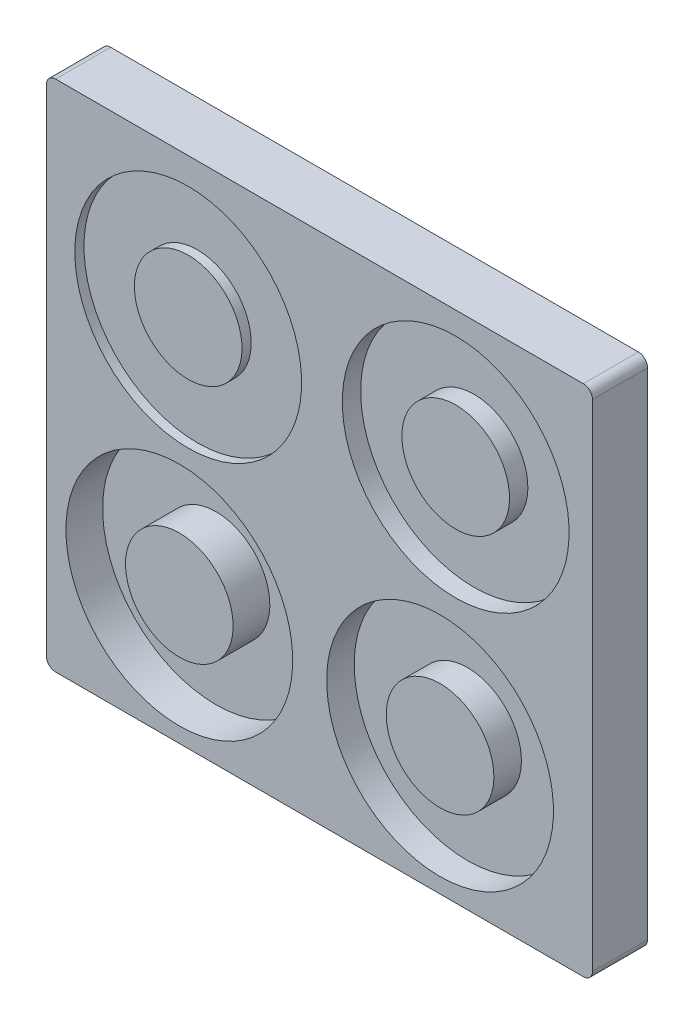
ISO-10303-21;
HEADER;
FILE_DESCRIPTION(('STEP AP214'),'2;1');
FILE_NAME('part.step','',(''),(''),'','','');
FILE_SCHEMA(('AUTOMOTIVE_DESIGN { 1 0 10303 214 1 1 1 1 }'));
ENDSEC;
DATA;
#1=APPLICATION_CONTEXT('core data for automotive mechanical design processes');
#2=APPLICATION_PROTOCOL_DEFINITION('international standard','automotive_design',2000,#1);
#3=PRODUCT_CONTEXT('',#1,'mechanical');
#4=PRODUCT('Part','Part','',(#3));
#5=PRODUCT_RELATED_PRODUCT_CATEGORY('part','',(#4));
#6=PRODUCT_DEFINITION_FORMATION('','',#4);
#7=PRODUCT_DEFINITION_CONTEXT('part definition',#1,'design');
#8=PRODUCT_DEFINITION('design','',#6,#7);
#9=PRODUCT_DEFINITION_SHAPE('','',#8);
#10=(LENGTH_UNIT() NAMED_UNIT(*) SI_UNIT(.MILLI.,.METRE.));
#11=(NAMED_UNIT(*) PLANE_ANGLE_UNIT() SI_UNIT($,.RADIAN.));
#12=(NAMED_UNIT(*) SI_UNIT($,.STERADIAN.) SOLID_ANGLE_UNIT());
#13=UNCERTAINTY_MEASURE_WITH_UNIT(LENGTH_MEASURE(1.E-05),#10,'distance_accuracy_value','');
#14=(GEOMETRIC_REPRESENTATION_CONTEXT(3) GLOBAL_UNCERTAINTY_ASSIGNED_CONTEXT((#13)) GLOBAL_UNIT_ASSIGNED_CONTEXT((#10,
#11,#12)) REPRESENTATION_CONTEXT('',''));
#15=CARTESIAN_POINT('',(0.,0.,0.));
#16=DIRECTION('',(0.,0.,1.));
#17=DIRECTION('',(1.,0.,0.));
#18=AXIS2_PLACEMENT_3D('',#15,#16,#17);
#19=CARTESIAN_POINT('',(-14.4541081383393,-39.7227767062655,0.));
#20=DIRECTION('',(0.,0.,1.));
#21=DIRECTION('',(1.,0.,0.));
#22=AXIS2_PLACEMENT_3D('',#19,#20,#21);
#23=PLANE('',#22);
#24=CARTESIAN_POINT('',(29.1575580222274,0.43729778627492,0.));
#25=DIRECTION('',(0.,0.,1.));
#26=DIRECTION('',(0.,-1.,0.));
#27=AXIS2_PLACEMENT_3D('',#24,#25,#26);
#28=CIRCLE('',#27,12.36);
#29=CARTESIAN_POINT('',(29.1575580222274,-11.9227022137251,0.));
#30=VERTEX_POINT('',#29);
#31=EDGE_CURVE('E337',#30,#30,#28,.T.);
#32=ORIENTED_EDGE('',*,*,#31,.F.);
#33=EDGE_LOOP('',(#32));
#34=FACE_BOUND('',#33,.T.);
#35=CARTESIAN_POINT('',(-0.968104394732787,-26.7082391513316,0.));
#36=DIRECTION('',(0.,0.,1.));
#37=DIRECTION('',(0.,-1.,0.));
#38=AXIS2_PLACEMENT_3D('',#35,#36,#37);
#39=CIRCLE('',#38,12.36);
#40=CARTESIAN_POINT('',(-0.968104394732787,-39.0682391513316,0.));
#41=VERTEX_POINT('',#40);
#42=EDGE_CURVE('E152',#41,#41,#39,.T.);
#43=ORIENTED_EDGE('',*,*,#42,.F.);
#44=EDGE_LOOP('',(#43));
#45=FACE_BOUND('',#44,.T.);
#46=CARTESIAN_POINT('',(-14.4541081383393,-39.7227767062655,0.));
#47=DIRECTION('',(0.,0.,1.));
#48=DIRECTION('',(1.,0.,0.));
#49=AXIS2_PLACEMENT_3D('',#46,#47,#48);
#50=CIRCLE('',#49,1.);
#51=CARTESIAN_POINT('',(-15.4541081383393,-39.7227767062655,0.));
#52=VERTEX_POINT('',#51);
#53=CARTESIAN_POINT('',(-14.4541081383393,-40.7227767062655,0.));
#54=VERTEX_POINT('',#53);
#55=EDGE_CURVE('E147',#52,#54,#50,.T.);
#56=ORIENTED_EDGE('',*,*,#55,.T.);
#57=DIRECTION('',(1.,0.,0.));
#58=VECTOR('',#57,1.);
#59=CARTESIAN_POINT('',(-14.4541081383393,-40.7227767062655,0.));
#60=LINE('',#59,#58);
#61=CARTESIAN_POINT('',(43.0726208084836,-40.7227767062655,0.));
#62=VERTEX_POINT('',#61);
#63=EDGE_CURVE('E151',#54,#62,#60,.T.);
#64=ORIENTED_EDGE('',*,*,#63,.T.);
#65=CARTESIAN_POINT('',(43.0726208084836,-39.7227767062655,0.));
#66=DIRECTION('',(0.,0.,1.));
#67=DIRECTION('',(-1.,0.,0.));
#68=AXIS2_PLACEMENT_3D('',#65,#66,#67);
#69=CIRCLE('',#68,0.999999999999997);
#70=CARTESIAN_POINT('',(44.0726208084836,-39.7227767062655,0.));
#71=VERTEX_POINT('',#70);
#72=EDGE_CURVE('E156',#62,#71,#69,.T.);
#73=ORIENTED_EDGE('',*,*,#72,.T.);
#74=DIRECTION('',(0.,1.,0.));
#75=VECTOR('',#74,1.);
#76=CARTESIAN_POINT('',(44.0726208084836,14.2579563912,0.));
#77=LINE('',#76,#75);
#78=CARTESIAN_POINT('',(44.0726208084836,14.2579563912,0.));
#79=VERTEX_POINT('',#78);
#80=EDGE_CURVE('E160',#71,#79,#77,.T.);
#81=ORIENTED_EDGE('',*,*,#80,.T.);
#82=CARTESIAN_POINT('',(43.0726208084836,14.2579563912,0.));
#83=DIRECTION('',(0.,0.,1.));
#84=DIRECTION('',(1.,0.,0.));
#85=AXIS2_PLACEMENT_3D('',#82,#83,#84);
#86=CIRCLE('',#85,1.);
#87=CARTESIAN_POINT('',(43.0726208084836,15.2579563912,0.));
#88=VERTEX_POINT('',#87);
#89=EDGE_CURVE('E164',#79,#88,#86,.T.);
#90=ORIENTED_EDGE('',*,*,#89,.T.);
#91=DIRECTION('',(-1.,0.,0.));
#92=VECTOR('',#91,1.);
#93=CARTESIAN_POINT('',(-14.4541081383393,15.2579563912,0.));
#94=LINE('',#93,#92);
#95=CARTESIAN_POINT('',(-14.4541081383393,15.2579563912,0.));
#96=VERTEX_POINT('',#95);
#97=EDGE_CURVE('E168',#88,#96,#94,.T.);
#98=ORIENTED_EDGE('',*,*,#97,.T.);
#99=CARTESIAN_POINT('',(-14.4541081383393,14.2579563912,0.));
#100=DIRECTION('',(0.,0.,1.));
#101=DIRECTION('',(-1.,0.,0.));
#102=AXIS2_PLACEMENT_3D('',#99,#100,#101);
#103=CIRCLE('',#102,1.);
#104=CARTESIAN_POINT('',(-15.4541081383393,14.2579563912,0.));
#105=VERTEX_POINT('',#104);
#106=EDGE_CURVE('E119',#96,#105,#103,.T.);
#107=ORIENTED_EDGE('',*,*,#106,.T.);
#108=DIRECTION('',(0.,-1.,0.));
#109=VECTOR('',#108,1.);
#110=CARTESIAN_POINT('',(-15.4541081383393,14.2579563912,0.));
#111=LINE('',#110,#109);
#112=EDGE_CURVE('E173',#105,#52,#111,.T.);
#113=ORIENTED_EDGE('',*,*,#112,.T.);
#114=EDGE_LOOP('',(#56,#64,#73,#81,#90,#98,#107,#113));
#115=FACE_BOUND('',#114,.T.);
#116=CARTESIAN_POINT('',(27.4531010206422,-26.7169449523038,0.));
#117=DIRECTION('',(0.,0.,1.));
#118=DIRECTION('',(0.,-1.,0.));
#119=AXIS2_PLACEMENT_3D('',#116,#117,#118);
#120=CIRCLE('',#119,12.36);
#121=CARTESIAN_POINT('',(27.4531010206422,-39.0769449523038,0.));
#122=VERTEX_POINT('',#121);
#123=EDGE_CURVE('E240',#122,#122,#120,.T.);
#124=ORIENTED_EDGE('',*,*,#123,.F.);
#125=EDGE_LOOP('',(#124));
#126=FACE_BOUND('',#125,.T.);
#127=CARTESIAN_POINT('',(0.,0.,0.));
#128=DIRECTION('',(0.,0.,1.));
#129=DIRECTION('',(0.,-1.,0.));
#130=AXIS2_PLACEMENT_3D('',#127,#128,#129);
#131=CIRCLE('',#130,12.36);
#132=CARTESIAN_POINT('',(0.,-12.36,0.));
#133=VERTEX_POINT('',#132);
#134=EDGE_CURVE('E360',#133,#133,#131,.T.);
#135=ORIENTED_EDGE('',*,*,#134,.F.);
#136=EDGE_LOOP('',(#135));
#137=FACE_BOUND('',#136,.T.);
#138=ADVANCED_FACE('F43',(#34,#45,#115,#126,#137),#23,.T.);
#139=CARTESIAN_POINT('',(-14.4541081383393,-39.7227767062655,-6.));
#140=DIRECTION('',(0.,0.,1.));
#141=DIRECTION('',(1.,0.,0.));
#142=AXIS2_PLACEMENT_3D('',#139,#140,#141);
#143=CYLINDRICAL_SURFACE('',#142,1.);
#144=ORIENTED_EDGE('',*,*,#55,.F.);
#145=DIRECTION('',(0.,0.,1.));
#146=VECTOR('',#145,1.);
#147=CARTESIAN_POINT('',(-15.4541081383393,-39.7227767062655,-6.));
#148=LINE('',#147,#146);
#149=CARTESIAN_POINT('',(-15.4541081383393,-39.7227767062655,-6.));
#150=VERTEX_POINT('',#149);
#151=EDGE_CURVE('E11',#150,#52,#148,.T.);
#152=ORIENTED_EDGE('',*,*,#151,.F.);
#153=CARTESIAN_POINT('',(-14.4541081383393,-39.7227767062655,-6.));
#154=DIRECTION('',(0.,0.,1.));
#155=DIRECTION('',(1.,0.,0.));
#156=AXIS2_PLACEMENT_3D('',#153,#154,#155);
#157=CIRCLE('',#156,1.);
#158=CARTESIAN_POINT('',(-14.4541081383393,-40.7227767062655,-6.));
#159=VERTEX_POINT('',#158);
#160=EDGE_CURVE('E176',#150,#159,#157,.T.);
#161=ORIENTED_EDGE('',*,*,#160,.T.);
#162=DIRECTION('',(0.,0.,1.));
#163=VECTOR('',#162,1.);
#164=CARTESIAN_POINT('',(-14.4541081383393,-40.7227767062655,-6.));
#165=LINE('',#164,#163);
#166=EDGE_CURVE('E47',#159,#54,#165,.T.);
#167=ORIENTED_EDGE('',*,*,#166,.T.);
#168=EDGE_LOOP('',(#144,#152,#161,#167));
#169=FACE_BOUND('',#168,.T.);
#170=ADVANCED_FACE('F45',(#169),#143,.T.);
#171=CARTESIAN_POINT('',(-15.4541081383393,14.2579563912,-6.));
#172=DIRECTION('',(-1.,0.,0.));
#173=DIRECTION('',(0.,0.,1.));
#174=AXIS2_PLACEMENT_3D('',#171,#172,#173);
#175=PLANE('',#174);
#176=ORIENTED_EDGE('',*,*,#112,.F.);
#177=DIRECTION('',(0.,0.,1.));
#178=VECTOR('',#177,1.);
#179=CARTESIAN_POINT('',(-15.4541081383393,14.2579563912,-6.));
#180=LINE('',#179,#178);
#181=CARTESIAN_POINT('',(-15.4541081383393,14.2579563912,-6.));
#182=VERTEX_POINT('',#181);
#183=EDGE_CURVE('E54',#182,#105,#180,.T.);
#184=ORIENTED_EDGE('',*,*,#183,.F.);
#185=DIRECTION('',(0.,-1.,0.));
#186=VECTOR('',#185,1.);
#187=CARTESIAN_POINT('',(-15.4541081383393,14.2579563912,-6.));
#188=LINE('',#187,#186);
#189=EDGE_CURVE('E133',#182,#150,#188,.T.);
#190=ORIENTED_EDGE('',*,*,#189,.T.);
#191=ORIENTED_EDGE('',*,*,#151,.T.);
#192=EDGE_LOOP('',(#176,#184,#190,#191));
#193=FACE_BOUND('',#192,.T.);
#194=ADVANCED_FACE('F194',(#193),#175,.T.);
#195=CARTESIAN_POINT('',(-14.4541081383393,14.2579563912,-6.));
#196=DIRECTION('',(0.,0.,1.));
#197=DIRECTION('',(1.,0.,0.));
#198=AXIS2_PLACEMENT_3D('',#195,#196,#197);
#199=CYLINDRICAL_SURFACE('',#198,1.);
#200=ORIENTED_EDGE('',*,*,#106,.F.);
#201=DIRECTION('',(0.,0.,1.));
#202=VECTOR('',#201,1.);
#203=CARTESIAN_POINT('',(-14.4541081383393,15.2579563912,-6.));
#204=LINE('',#203,#202);
#205=CARTESIAN_POINT('',(-14.4541081383393,15.2579563912,-6.));
#206=VERTEX_POINT('',#205);
#207=EDGE_CURVE('E114',#206,#96,#204,.T.);
#208=ORIENTED_EDGE('',*,*,#207,.F.);
#209=CARTESIAN_POINT('',(-14.4541081383393,14.2579563912,-6.));
#210=DIRECTION('',(0.,0.,1.));
#211=DIRECTION('',(-1.,0.,0.));
#212=AXIS2_PLACEMENT_3D('',#209,#210,#211);
#213=CIRCLE('',#212,1.);
#214=EDGE_CURVE('E117',#206,#182,#213,.T.);
#215=ORIENTED_EDGE('',*,*,#214,.T.);
#216=ORIENTED_EDGE('',*,*,#183,.T.);
#217=EDGE_LOOP('',(#200,#208,#215,#216));
#218=FACE_BOUND('',#217,.T.);
#219=ADVANCED_FACE('F116',(#218),#199,.T.);
#220=CARTESIAN_POINT('',(-14.4541081383393,15.2579563912,-6.));
#221=DIRECTION('',(0.,1.,0.));
#222=DIRECTION('',(0.,0.,1.));
#223=AXIS2_PLACEMENT_3D('',#220,#221,#222);
#224=PLANE('',#223);
#225=ORIENTED_EDGE('',*,*,#97,.F.);
#226=DIRECTION('',(0.,0.,1.));
#227=VECTOR('',#226,1.);
#228=CARTESIAN_POINT('',(43.0726208084836,15.2579563912,-6.));
#229=LINE('',#228,#227);
#230=CARTESIAN_POINT('',(43.0726208084836,15.2579563912,-6.));
#231=VERTEX_POINT('',#230);
#232=EDGE_CURVE('E125',#231,#88,#229,.T.);
#233=ORIENTED_EDGE('',*,*,#232,.F.);
#234=DIRECTION('',(-1.,0.,0.));
#235=VECTOR('',#234,1.);
#236=CARTESIAN_POINT('',(-14.4541081383393,15.2579563912,-6.));
#237=LINE('',#236,#235);
#238=EDGE_CURVE('E131',#231,#206,#237,.T.);
#239=ORIENTED_EDGE('',*,*,#238,.T.);
#240=ORIENTED_EDGE('',*,*,#207,.T.);
#241=EDGE_LOOP('',(#225,#233,#239,#240));
#242=FACE_BOUND('',#241,.T.);
#243=ADVANCED_FACE('F136',(#242),#224,.T.);
#244=CARTESIAN_POINT('',(43.0726208084836,14.2579563912,-6.));
#245=DIRECTION('',(0.,0.,1.));
#246=DIRECTION('',(1.,0.,0.));
#247=AXIS2_PLACEMENT_3D('',#244,#245,#246);
#248=CYLINDRICAL_SURFACE('',#247,1.);
#249=ORIENTED_EDGE('',*,*,#89,.F.);
#250=DIRECTION('',(0.,0.,1.));
#251=VECTOR('',#250,1.);
#252=CARTESIAN_POINT('',(44.0726208084836,14.2579563912,-6.));
#253=LINE('',#252,#251);
#254=CARTESIAN_POINT('',(44.0726208084836,14.2579563912,-6.));
#255=VERTEX_POINT('',#254);
#256=EDGE_CURVE('E182',#255,#79,#253,.T.);
#257=ORIENTED_EDGE('',*,*,#256,.F.);
#258=CARTESIAN_POINT('',(43.0726208084836,14.2579563912,-6.));
#259=DIRECTION('',(0.,0.,1.));
#260=DIRECTION('',(1.,0.,0.));
#261=AXIS2_PLACEMENT_3D('',#258,#259,#260);
#262=CIRCLE('',#261,1.);
#263=EDGE_CURVE('E138',#255,#231,#262,.T.);
#264=ORIENTED_EDGE('',*,*,#263,.T.);
#265=ORIENTED_EDGE('',*,*,#232,.T.);
#266=EDGE_LOOP('',(#249,#257,#264,#265));
#267=FACE_BOUND('',#266,.T.);
#268=ADVANCED_FACE('F268',(#267),#248,.T.);
#269=CARTESIAN_POINT('',(44.0726208084836,14.2579563912,-6.));
#270=DIRECTION('',(1.,0.,0.));
#271=DIRECTION('',(0.,1.,0.));
#272=AXIS2_PLACEMENT_3D('',#269,#270,#271);
#273=PLANE('',#272);
#274=ORIENTED_EDGE('',*,*,#80,.F.);
#275=DIRECTION('',(0.,0.,1.));
#276=VECTOR('',#275,1.);
#277=CARTESIAN_POINT('',(44.0726208084836,-39.7227767062655,-6.));
#278=LINE('',#277,#276);
#279=CARTESIAN_POINT('',(44.0726208084836,-39.7227767062655,-6.));
#280=VERTEX_POINT('',#279);
#281=EDGE_CURVE('E185',#280,#71,#278,.T.);
#282=ORIENTED_EDGE('',*,*,#281,.F.);
#283=DIRECTION('',(0.,1.,0.));
#284=VECTOR('',#283,1.);
#285=CARTESIAN_POINT('',(44.0726208084836,14.2579563912,-6.));
#286=LINE('',#285,#284);
#287=EDGE_CURVE('E141',#280,#255,#286,.T.);
#288=ORIENTED_EDGE('',*,*,#287,.T.);
#289=ORIENTED_EDGE('',*,*,#256,.T.);
#290=EDGE_LOOP('',(#274,#282,#288,#289));
#291=FACE_BOUND('',#290,.T.);
#292=ADVANCED_FACE('F262',(#291),#273,.T.);
#293=CARTESIAN_POINT('',(43.0726208084836,-39.7227767062655,-6.));
#294=DIRECTION('',(0.,0.,1.));
#295=DIRECTION('',(1.,0.,0.));
#296=AXIS2_PLACEMENT_3D('',#293,#294,#295);
#297=CYLINDRICAL_SURFACE('',#296,0.999999999999997);
#298=ORIENTED_EDGE('',*,*,#72,.F.);
#299=DIRECTION('',(0.,0.,1.));
#300=VECTOR('',#299,1.);
#301=CARTESIAN_POINT('',(43.0726208084836,-40.7227767062655,-6.));
#302=LINE('',#301,#300);
#303=CARTESIAN_POINT('',(43.0726208084836,-40.7227767062655,-6.));
#304=VERTEX_POINT('',#303);
#305=EDGE_CURVE('E187',#304,#62,#302,.T.);
#306=ORIENTED_EDGE('',*,*,#305,.F.);
#307=CARTESIAN_POINT('',(43.0726208084836,-39.7227767062655,-6.));
#308=DIRECTION('',(0.,0.,1.));
#309=DIRECTION('',(-1.,0.,0.));
#310=AXIS2_PLACEMENT_3D('',#307,#308,#309);
#311=CIRCLE('',#310,0.999999999999997);
#312=EDGE_CURVE('E254',#304,#280,#311,.T.);
#313=ORIENTED_EDGE('',*,*,#312,.T.);
#314=ORIENTED_EDGE('',*,*,#281,.T.);
#315=EDGE_LOOP('',(#298,#306,#313,#314));
#316=FACE_BOUND('',#315,.T.);
#317=ADVANCED_FACE('F266',(#316),#297,.T.);
#318=CARTESIAN_POINT('',(-14.4541081383393,-40.7227767062655,-6.));
#319=DIRECTION('',(0.,-1.,0.));
#320=DIRECTION('',(0.,0.,-1.));
#321=AXIS2_PLACEMENT_3D('',#318,#319,#320);
#322=PLANE('',#321);
#323=ORIENTED_EDGE('',*,*,#63,.F.);
#324=ORIENTED_EDGE('',*,*,#166,.F.);
#325=DIRECTION('',(1.,0.,0.));
#326=VECTOR('',#325,1.);
#327=CARTESIAN_POINT('',(-14.4541081383393,-40.7227767062655,-6.));
#328=LINE('',#327,#326);
#329=EDGE_CURVE('E251',#159,#304,#328,.T.);
#330=ORIENTED_EDGE('',*,*,#329,.T.);
#331=ORIENTED_EDGE('',*,*,#305,.T.);
#332=EDGE_LOOP('',(#323,#324,#330,#331));
#333=FACE_BOUND('',#332,.T.);
#334=ADVANCED_FACE('F191',(#333),#322,.T.);
#335=CARTESIAN_POINT('',(-14.4541081383393,-39.7227767062655,-6.));
#336=DIRECTION('',(0.,0.,1.));
#337=DIRECTION('',(1.,0.,0.));
#338=AXIS2_PLACEMENT_3D('',#335,#336,#337);
#339=PLANE('',#338);
#340=ORIENTED_EDGE('',*,*,#160,.F.);
#341=ORIENTED_EDGE('',*,*,#189,.F.);
#342=ORIENTED_EDGE('',*,*,#214,.F.);
#343=ORIENTED_EDGE('',*,*,#238,.F.);
#344=ORIENTED_EDGE('',*,*,#263,.F.);
#345=ORIENTED_EDGE('',*,*,#287,.F.);
#346=ORIENTED_EDGE('',*,*,#312,.F.);
#347=ORIENTED_EDGE('',*,*,#329,.F.);
#348=EDGE_LOOP('',(#340,#341,#342,#343,#344,#345,#346,#347));
#349=FACE_BOUND('',#348,.T.);
#350=ADVANCED_FACE('F129',(#349),#339,.F.);
#351=CARTESIAN_POINT('',(-0.968104394732787,-26.7082391513316,0.));
#352=DIRECTION('',(0.,0.,-1.));
#353=DIRECTION('',(0.,1.,0.));
#354=AXIS2_PLACEMENT_3D('',#351,#352,#353);
#355=CYLINDRICAL_SURFACE('',#354,12.36);
#356=ORIENTED_EDGE('',*,*,#42,.T.);
#357=EDGE_LOOP('',(#356));
#358=FACE_BOUND('',#357,.T.);
#359=CARTESIAN_POINT('',(-0.968104394732787,-26.7082391513316,-4.));
#360=DIRECTION('',(0.,0.,1.));
#361=DIRECTION('',(0.,-1.,0.));
#362=AXIS2_PLACEMENT_3D('',#359,#360,#361);
#363=CIRCLE('',#362,12.36);
#364=CARTESIAN_POINT('',(-0.968104394732787,-39.0682391513316,-4.));
#365=VERTEX_POINT('',#364);
#366=EDGE_CURVE('E232',#365,#365,#363,.T.);
#367=ORIENTED_EDGE('',*,*,#366,.F.);
#368=EDGE_LOOP('',(#367));
#369=FACE_BOUND('',#368,.T.);
#370=ADVANCED_FACE('F283',(#358,#369),#355,.F.);
#371=CARTESIAN_POINT('',(-0.968104394732787,-26.7082391513316,-4.));
#372=DIRECTION('',(0.,0.,1.));
#373=DIRECTION('',(0.,-1.,0.));
#374=AXIS2_PLACEMENT_3D('',#371,#372,#373);
#375=PLANE('',#374);
#376=CARTESIAN_POINT('',(-0.968104394732787,-26.7082391513316,-4.));
#377=DIRECTION('',(0.,0.,-1.));
#378=DIRECTION('',(0.,1.,0.));
#379=AXIS2_PLACEMENT_3D('',#376,#377,#378);
#380=CIRCLE('',#379,5.8674);
#381=CARTESIAN_POINT('',(-0.968104394732787,-20.8408391513316,-4.));
#382=VERTEX_POINT('',#381);
#383=EDGE_CURVE('E233',#382,#382,#380,.T.);
#384=ORIENTED_EDGE('',*,*,#383,.T.);
#385=EDGE_LOOP('',(#384));
#386=FACE_BOUND('',#385,.T.);
#387=ORIENTED_EDGE('',*,*,#366,.T.);
#388=EDGE_LOOP('',(#387));
#389=FACE_BOUND('',#388,.T.);
#390=ADVANCED_FACE('F287',(#386,#389),#375,.T.);
#391=CARTESIAN_POINT('',(-0.968104394732787,-26.7082391513316,0.));
#392=DIRECTION('',(0.,0.,-1.));
#393=DIRECTION('',(0.,1.,0.));
#394=AXIS2_PLACEMENT_3D('',#391,#392,#393);
#395=CYLINDRICAL_SURFACE('',#394,5.8674);
#396=CARTESIAN_POINT('',(-0.968104394732787,-26.7082391513316,0.));
#397=DIRECTION('',(0.,0.,-1.));
#398=DIRECTION('',(0.,1.,0.));
#399=AXIS2_PLACEMENT_3D('',#396,#397,#398);
#400=CIRCLE('',#399,5.8674);
#401=CARTESIAN_POINT('',(-0.968104394732787,-20.8408391513316,0.));
#402=VERTEX_POINT('',#401);
#403=EDGE_CURVE('E229',#402,#402,#400,.T.);
#404=ORIENTED_EDGE('',*,*,#403,.T.);
#405=EDGE_LOOP('',(#404));
#406=FACE_BOUND('',#405,.T.);
#407=ORIENTED_EDGE('',*,*,#383,.F.);
#408=EDGE_LOOP('',(#407));
#409=FACE_BOUND('',#408,.T.);
#410=ADVANCED_FACE('F293',(#406,#409),#395,.T.);
#411=CARTESIAN_POINT('',(27.4531010206422,-26.7169449523038,0.));
#412=DIRECTION('',(0.,0.,-1.));
#413=DIRECTION('',(0.,1.,0.));
#414=AXIS2_PLACEMENT_3D('',#411,#412,#413);
#415=CYLINDRICAL_SURFACE('',#414,12.36);
#416=ORIENTED_EDGE('',*,*,#123,.T.);
#417=EDGE_LOOP('',(#416));
#418=FACE_BOUND('',#417,.T.);
#419=CARTESIAN_POINT('',(27.4531010206422,-26.7169449523038,-3.00000000000005));
#420=DIRECTION('',(0.,0.,1.));
#421=DIRECTION('',(0.,-1.,0.));
#422=AXIS2_PLACEMENT_3D('',#419,#420,#421);
#423=CIRCLE('',#422,12.36);
#424=CARTESIAN_POINT('',(27.4531010206422,-39.0769449523038,-3.00000000000005));
#425=VERTEX_POINT('',#424);
#426=EDGE_CURVE('E341',#425,#425,#423,.T.);
#427=ORIENTED_EDGE('',*,*,#426,.F.);
#428=EDGE_LOOP('',(#427));
#429=FACE_BOUND('',#428,.T.);
#430=ADVANCED_FACE('F297',(#418,#429),#415,.F.);
#431=CARTESIAN_POINT('',(27.4531010206422,-26.7169449523038,-3.00000000000005));
#432=DIRECTION('',(0.,0.,1.));
#433=DIRECTION('',(0.,-1.,0.));
#434=AXIS2_PLACEMENT_3D('',#431,#432,#433);
#435=PLANE('',#434);
#436=CARTESIAN_POINT('',(27.4531010206422,-26.7169449523038,-3.00000000000005));
#437=DIRECTION('',(0.,0.,-1.));
#438=DIRECTION('',(0.,1.,0.));
#439=AXIS2_PLACEMENT_3D('',#436,#437,#438);
#440=CIRCLE('',#439,5.8674);
#441=CARTESIAN_POINT('',(27.4531010206422,-20.8495449523038,-3.00000000000005));
#442=VERTEX_POINT('',#441);
#443=EDGE_CURVE('E335',#442,#442,#440,.T.);
#444=ORIENTED_EDGE('',*,*,#443,.T.);
#445=EDGE_LOOP('',(#444));
#446=FACE_BOUND('',#445,.T.);
#447=ORIENTED_EDGE('',*,*,#426,.T.);
#448=EDGE_LOOP('',(#447));
#449=FACE_BOUND('',#448,.T.);
#450=ADVANCED_FACE('F320',(#446,#449),#435,.T.);
#451=CARTESIAN_POINT('',(27.4531010206422,-26.7169449523038,0.));
#452=DIRECTION('',(0.,0.,-1.));
#453=DIRECTION('',(0.,1.,0.));
#454=AXIS2_PLACEMENT_3D('',#451,#452,#453);
#455=CYLINDRICAL_SURFACE('',#454,5.8674);
#456=CARTESIAN_POINT('',(27.4531010206422,-26.7169449523038,0.));
#457=DIRECTION('',(0.,0.,-1.));
#458=DIRECTION('',(0.,1.,0.));
#459=AXIS2_PLACEMENT_3D('',#456,#457,#458);
#460=CIRCLE('',#459,5.8674);
#461=CARTESIAN_POINT('',(27.4531010206422,-20.8495449523038,0.));
#462=VERTEX_POINT('',#461);
#463=EDGE_CURVE('E332',#462,#462,#460,.T.);
#464=ORIENTED_EDGE('',*,*,#463,.T.);
#465=EDGE_LOOP('',(#464));
#466=FACE_BOUND('',#465,.T.);
#467=ORIENTED_EDGE('',*,*,#443,.F.);
#468=EDGE_LOOP('',(#467));
#469=FACE_BOUND('',#468,.T.);
#470=ADVANCED_FACE('F310',(#466,#469),#455,.T.);
#471=CARTESIAN_POINT('',(29.1575580222274,0.43729778627492,0.));
#472=DIRECTION('',(0.,0.,-1.));
#473=DIRECTION('',(0.,1.,0.));
#474=AXIS2_PLACEMENT_3D('',#471,#472,#473);
#475=CYLINDRICAL_SURFACE('',#474,12.36);
#476=ORIENTED_EDGE('',*,*,#31,.T.);
#477=EDGE_LOOP('',(#476));
#478=FACE_BOUND('',#477,.T.);
#479=CARTESIAN_POINT('',(29.1575580222274,0.43729778627492,-2.00000000000009));
#480=DIRECTION('',(0.,0.,1.));
#481=DIRECTION('',(0.,-1.,0.));
#482=AXIS2_PLACEMENT_3D('',#479,#480,#481);
#483=CIRCLE('',#482,12.36);
#484=CARTESIAN_POINT('',(29.1575580222274,-11.9227022137251,-2.00000000000009));
#485=VERTEX_POINT('',#484);
#486=EDGE_CURVE('E344',#485,#485,#483,.T.);
#487=ORIENTED_EDGE('',*,*,#486,.F.);
#488=EDGE_LOOP('',(#487));
#489=FACE_BOUND('',#488,.T.);
#490=ADVANCED_FACE('F306',(#478,#489),#475,.F.);
#491=CARTESIAN_POINT('',(29.1575580222274,0.43729778627492,-2.00000000000009));
#492=DIRECTION('',(0.,0.,1.));
#493=DIRECTION('',(0.,-1.,0.));
#494=AXIS2_PLACEMENT_3D('',#491,#492,#493);
#495=PLANE('',#494);
#496=CARTESIAN_POINT('',(29.1575580222274,0.43729778627492,-2.00000000000009));
#497=DIRECTION('',(0.,0.,-1.));
#498=DIRECTION('',(0.,1.,0.));
#499=AXIS2_PLACEMENT_3D('',#496,#497,#498);
#500=CIRCLE('',#499,5.8674);
#501=CARTESIAN_POINT('',(29.1575580222274,6.30469778627492,-2.00000000000009));
#502=VERTEX_POINT('',#501);
#503=EDGE_CURVE('E357',#502,#502,#500,.T.);
#504=ORIENTED_EDGE('',*,*,#503,.T.);
#505=EDGE_LOOP('',(#504));
#506=FACE_BOUND('',#505,.T.);
#507=ORIENTED_EDGE('',*,*,#486,.T.);
#508=EDGE_LOOP('',(#507));
#509=FACE_BOUND('',#508,.T.);
#510=ADVANCED_FACE('F309',(#506,#509),#495,.T.);
#511=CARTESIAN_POINT('',(29.1575580222274,0.43729778627492,0.));
#512=DIRECTION('',(0.,0.,-1.));
#513=DIRECTION('',(0.,1.,0.));
#514=AXIS2_PLACEMENT_3D('',#511,#512,#513);
#515=CYLINDRICAL_SURFACE('',#514,5.8674);
#516=CARTESIAN_POINT('',(29.1575580222274,0.43729778627492,0.));
#517=DIRECTION('',(0.,0.,-1.));
#518=DIRECTION('',(0.,1.,0.));
#519=AXIS2_PLACEMENT_3D('',#516,#517,#518);
#520=CIRCLE('',#519,5.8674);
#521=CARTESIAN_POINT('',(29.1575580222274,6.30469778627492,0.));
#522=VERTEX_POINT('',#521);
#523=EDGE_CURVE('E353',#522,#522,#520,.T.);
#524=ORIENTED_EDGE('',*,*,#523,.T.);
#525=EDGE_LOOP('',(#524));
#526=FACE_BOUND('',#525,.T.);
#527=ORIENTED_EDGE('',*,*,#503,.F.);
#528=EDGE_LOOP('',(#527));
#529=FACE_BOUND('',#528,.T.);
#530=ADVANCED_FACE('F301',(#526,#529),#515,.T.);
#531=CARTESIAN_POINT('',(0.,0.,0.));
#532=DIRECTION('',(0.,0.,-1.));
#533=DIRECTION('',(0.,1.,0.));
#534=AXIS2_PLACEMENT_3D('',#531,#532,#533);
#535=CYLINDRICAL_SURFACE('',#534,12.36);
#536=ORIENTED_EDGE('',*,*,#134,.T.);
#537=EDGE_LOOP('',(#536));
#538=FACE_BOUND('',#537,.T.);
#539=CARTESIAN_POINT('',(0.,0.,-1.));
#540=DIRECTION('',(0.,0.,1.));
#541=DIRECTION('',(0.,-1.,0.));
#542=AXIS2_PLACEMENT_3D('',#539,#540,#541);
#543=CIRCLE('',#542,12.36);
#544=CARTESIAN_POINT('',(0.,-12.36,-1.));
#545=VERTEX_POINT('',#544);
#546=EDGE_CURVE('E243',#545,#545,#543,.T.);
#547=ORIENTED_EDGE('',*,*,#546,.F.);
#548=EDGE_LOOP('',(#547));
#549=FACE_BOUND('',#548,.T.);
#550=ADVANCED_FACE('F298',(#538,#549),#535,.F.);
#551=CARTESIAN_POINT('',(0.,0.,-1.));
#552=DIRECTION('',(0.,0.,1.));
#553=DIRECTION('',(0.,-1.,0.));
#554=AXIS2_PLACEMENT_3D('',#551,#552,#553);
#555=PLANE('',#554);
#556=CARTESIAN_POINT('',(0.,0.,-1.));
#557=DIRECTION('',(0.,0.,-1.));
#558=DIRECTION('',(0.,1.,0.));
#559=AXIS2_PLACEMENT_3D('',#556,#557,#558);
#560=CIRCLE('',#559,5.8674);
#561=CARTESIAN_POINT('',(0.,5.8674,-1.));
#562=VERTEX_POINT('',#561);
#563=EDGE_CURVE('E369',#562,#562,#560,.T.);
#564=ORIENTED_EDGE('',*,*,#563,.T.);
#565=EDGE_LOOP('',(#564));
#566=FACE_BOUND('',#565,.T.);
#567=ORIENTED_EDGE('',*,*,#546,.T.);
#568=EDGE_LOOP('',(#567));
#569=FACE_BOUND('',#568,.T.);
#570=ADVANCED_FACE('F224',(#566,#569),#555,.T.);
#571=CARTESIAN_POINT('',(0.,0.,0.));
#572=DIRECTION('',(0.,0.,-1.));
#573=DIRECTION('',(0.,1.,0.));
#574=AXIS2_PLACEMENT_3D('',#571,#572,#573);
#575=CYLINDRICAL_SURFACE('',#574,5.8674);
#576=CARTESIAN_POINT('',(0.,0.,0.));
#577=DIRECTION('',(0.,0.,-1.));
#578=DIRECTION('',(0.,1.,0.));
#579=AXIS2_PLACEMENT_3D('',#576,#577,#578);
#580=CIRCLE('',#579,5.8674);
#581=CARTESIAN_POINT('',(0.,5.8674,0.));
#582=VERTEX_POINT('',#581);
#583=EDGE_CURVE('E365',#582,#582,#580,.T.);
#584=ORIENTED_EDGE('',*,*,#583,.T.);
#585=EDGE_LOOP('',(#584));
#586=FACE_BOUND('',#585,.T.);
#587=ORIENTED_EDGE('',*,*,#563,.F.);
#588=EDGE_LOOP('',(#587));
#589=FACE_BOUND('',#588,.T.);
#590=ADVANCED_FACE('F217',(#586,#589),#575,.T.);
#591=ORIENTED_EDGE('',*,*,#403,.F.);
#592=EDGE_LOOP('',(#591));
#593=FACE_BOUND('',#592,.T.);
#594=ADVANCED_FACE('F206',(#593),#23,.T.);
#595=ORIENTED_EDGE('',*,*,#463,.F.);
#596=EDGE_LOOP('',(#595));
#597=FACE_BOUND('',#596,.T.);
#598=ADVANCED_FACE('F216',(#597),#23,.T.);
#599=ORIENTED_EDGE('',*,*,#523,.F.);
#600=EDGE_LOOP('',(#599));
#601=FACE_BOUND('',#600,.T.);
#602=ADVANCED_FACE('F213',(#601),#23,.T.);
#603=ORIENTED_EDGE('',*,*,#583,.F.);
#604=EDGE_LOOP('',(#603));
#605=FACE_BOUND('',#604,.T.);
#606=ADVANCED_FACE('F205',(#605),#23,.T.);
#607=CLOSED_SHELL('',(#138,#170,#194,#219,#243,#268,#292,#317,#334,#350,#370,#390,#410,#430,
#450,#470,#490,#510,#530,#550,#570,#590,#594,#598,#602,#606));
#608=MANIFOLD_SOLID_BREP('B2',#607);
#609=ADVANCED_BREP_SHAPE_REPRESENTATION('',(#18,#608),#14);
#610=SHAPE_DEFINITION_REPRESENTATION(#9,#609);
ENDSEC;
END-ISO-10303-21;
